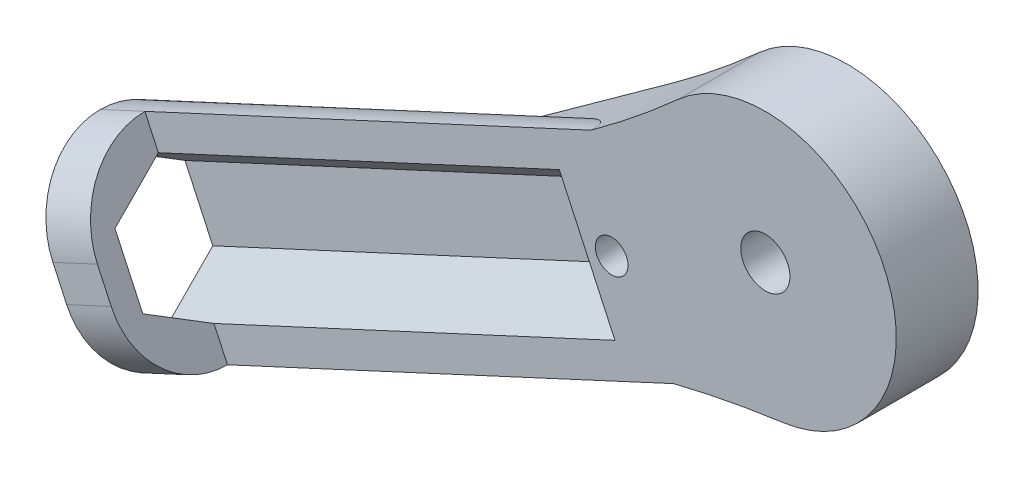
ISO-10303-21;
HEADER;
FILE_DESCRIPTION(('STEP AP214'),'2;1');
FILE_NAME('part.step','',(''),(''),'','','');
FILE_SCHEMA(('AUTOMOTIVE_DESIGN { 1 0 10303 214 1 1 1 1 }'));
ENDSEC;
DATA;
#1=APPLICATION_CONTEXT('core data for automotive mechanical design processes');
#2=APPLICATION_PROTOCOL_DEFINITION('international standard','automotive_design',2000,#1);
#3=PRODUCT_CONTEXT('',#1,'mechanical');
#4=PRODUCT('Part','Part','',(#3));
#5=PRODUCT_RELATED_PRODUCT_CATEGORY('part','',(#4));
#6=PRODUCT_DEFINITION_FORMATION('','',#4);
#7=PRODUCT_DEFINITION_CONTEXT('part definition',#1,'design');
#8=PRODUCT_DEFINITION('design','',#6,#7);
#9=PRODUCT_DEFINITION_SHAPE('','',#8);
#10=(LENGTH_UNIT() NAMED_UNIT(*) SI_UNIT(.MILLI.,.METRE.));
#11=(NAMED_UNIT(*) PLANE_ANGLE_UNIT() SI_UNIT($,.RADIAN.));
#12=(NAMED_UNIT(*) SI_UNIT($,.STERADIAN.) SOLID_ANGLE_UNIT());
#13=UNCERTAINTY_MEASURE_WITH_UNIT(LENGTH_MEASURE(1.E-05),#10,'distance_accuracy_value','');
#14=(GEOMETRIC_REPRESENTATION_CONTEXT(3) GLOBAL_UNCERTAINTY_ASSIGNED_CONTEXT((#13)) GLOBAL_UNIT_ASSIGNED_CONTEXT((#10,
#11,#12)) REPRESENTATION_CONTEXT('',''));
#15=CARTESIAN_POINT('',(0.,0.,0.));
#16=DIRECTION('',(0.,0.,1.));
#17=DIRECTION('',(1.,0.,0.));
#18=AXIS2_PLACEMENT_3D('',#15,#16,#17);
#19=CARTESIAN_POINT('',(6.53337750667996,9.63205993138693,10.));
#20=DIRECTION('',(0.,0.,1.));
#21=DIRECTION('',(1.,0.,0.));
#22=AXIS2_PLACEMENT_3D('',#19,#20,#21);
#23=PLANE('',#22);
#24=DIRECTION('',(-0.907296365048531,-0.420491743045832,0.));
#25=VECTOR('',#24,1.);
#26=CARTESIAN_POINT('',(9.47681970800078,3.28098537604723,10.));
#27=LINE('',#26,#25);
#28=CARTESIAN_POINT('',(-17.7420712434552,-9.33376691532774,10.));
#29=VERTEX_POINT('',#28);
#30=CARTESIAN_POINT('',(-15.0201821483096,-8.07229168619023,10.));
#31=VERTEX_POINT('',#30);
#32=EDGE_CURVE('E262',#29,#31,#27,.F.);
#33=ORIENTED_EDGE('',*,*,#32,.T.);
#34=DIRECTION('',(0.420491743045832,-0.907296365048531,0.));
#35=VECTOR('',#34,1.);
#36=CARTESIAN_POINT('',(-15.8611656378721,-6.2576989486042,10.));
#37=LINE('',#36,#35);
#38=CARTESIAN_POINT('',(-15.8611656378721,-6.2576989486042,10.));
#39=VERTEX_POINT('',#38);
#40=EDGE_CURVE('E197',#39,#31,#37,.T.);
#41=ORIENTED_EDGE('',*,*,#40,.F.);
#42=DIRECTION('',(-0.907296365048532,-0.420491743045832,0.));
#43=VECTOR('',#42,1.);
#44=CARTESIAN_POINT('',(-18.5830547330177,-7.51917417774169,10.));
#45=LINE('',#44,#43);
#46=CARTESIAN_POINT('',(-18.5830547330176,-7.51917417774169,10.));
#47=VERTEX_POINT('',#46);
#48=EDGE_CURVE('E296',#39,#47,#45,.T.);
#49=ORIENTED_EDGE('',*,*,#48,.T.);
#50=DIRECTION('',(-0.420491743045832,0.907296365048532,0.));
#51=VECTOR('',#50,1.);
#52=CARTESIAN_POINT('',(-20.685513444776,-2.98269235998802,10.));
#53=LINE('',#52,#51);
#54=EDGE_CURVE('E207',#29,#47,#53,.T.);
#55=ORIENTED_EDGE('',*,*,#54,.F.);
#56=EDGE_LOOP('',(#33,#41,#49,#55));
#57=FACE_BOUND('',#56,.T.);
#58=ADVANCED_FACE('F35',(#57),#23,.T.);
#59=CARTESIAN_POINT('',(-25.0004421505591,-12.6977008535377,5.));
#60=DIRECTION('',(0.907296365048531,0.420491743045832,0.));
#61=DIRECTION('',(-0.420491743045832,0.907296365048531,0.));
#62=AXIS2_PLACEMENT_3D('',#59,#60,#61);
#63=CYLINDRICAL_SURFACE('',#62,5.);
#64=DIRECTION('',(-0.907296365048531,-0.420491743045832,0.));
#65=VECTOR('',#64,1.);
#66=CARTESIAN_POINT('',(-15.639612528226,-13.8702487405704,5.));
#67=LINE('',#66,#65);
#68=CARTESIAN_POINT('',(-12.9177234330804,-12.6087735114329,5.00000000000001));
#69=VERTEX_POINT('',#68);
#70=CARTESIAN_POINT('',(-15.639612528226,-13.8702487405704,5.));
#71=VERTEX_POINT('',#70);
#72=EDGE_CURVE('E206',#69,#71,#67,.T.);
#73=ORIENTED_EDGE('',*,*,#72,.F.);
#74=CARTESIAN_POINT('',(-15.0201821483096,-8.07229168619023,5.00000000000001));
#75=DIRECTION('',(0.907296365048532,0.420491743045832,0.));
#76=DIRECTION('',(-0.420491743045832,0.907296365048532,0.));
#77=AXIS2_PLACEMENT_3D('',#74,#75,#76);
#78=CIRCLE('',#77,5.);
#79=EDGE_CURVE('E199',#31,#69,#78,.T.);
#80=ORIENTED_EDGE('',*,*,#79,.F.);
#81=ORIENTED_EDGE('',*,*,#32,.F.);
#82=CARTESIAN_POINT('',(-17.7420712434552,-9.33376691532774,5.));
#83=DIRECTION('',(0.907296365048532,0.420491743045832,0.));
#84=DIRECTION('',(-0.420491743045832,0.907296365048532,0.));
#85=AXIS2_PLACEMENT_3D('',#82,#83,#84);
#86=CIRCLE('',#85,5.);
#87=EDGE_CURVE('E286',#71,#29,#86,.F.);
#88=ORIENTED_EDGE('',*,*,#87,.F.);
#89=EDGE_LOOP('',(#73,#80,#81,#88));
#90=FACE_BOUND('',#89,.T.);
#91=ADVANCED_FACE('F270',(#90),#63,.T.);
#92=CARTESIAN_POINT('',(8.6358362184383,5.09557811363326,5.));
#93=DIRECTION('',(0.907296365048532,0.420491743045832,0.));
#94=DIRECTION('',(-0.420491743045832,0.907296365048532,0.));
#95=AXIS2_PLACEMENT_3D('',#92,#93,#94);
#96=CYLINDRICAL_SURFACE('',#95,5.);
#97=ORIENTED_EDGE('',*,*,#48,.F.);
#98=CARTESIAN_POINT('',(-15.8611656378721,-6.2576989486042,5.00000000000001));
#99=DIRECTION('',(0.907296365048532,0.420491743045832,0.));
#100=DIRECTION('',(-0.420491743045832,0.907296365048532,0.));
#101=AXIS2_PLACEMENT_3D('',#98,#99,#100);
#102=CIRCLE('',#101,4.99999999587291);
#103=CARTESIAN_POINT('',(-17.9636243531012,-1.72121712336154,5.));
#104=VERTEX_POINT('',#103);
#105=EDGE_CURVE('E187',#104,#39,#102,.T.);
#106=ORIENTED_EDGE('',*,*,#105,.F.);
#107=DIRECTION('',(-0.907296365048532,-0.420491743045832,0.));
#108=VECTOR('',#107,1.);
#109=CARTESIAN_POINT('',(9.29973298295998,10.9141433709005,5.));
#110=LINE('',#109,#108);
#111=CARTESIAN_POINT('',(-20.6855134482468,-2.98269235249903,5.));
#112=VERTEX_POINT('',#111);
#113=EDGE_CURVE('E352',#104,#112,#110,.T.);
#114=ORIENTED_EDGE('',*,*,#113,.T.);
#115=CARTESIAN_POINT('',(-18.5830547330176,-7.51917417774169,5.));
#116=DIRECTION('',(0.907296365048532,0.420491743045832,0.));
#117=DIRECTION('',(-0.420491743045832,0.907296365048532,0.));
#118=AXIS2_PLACEMENT_3D('',#115,#116,#117);
#119=CIRCLE('',#118,5.);
#120=EDGE_CURVE('E298',#47,#112,#119,.F.);
#121=ORIENTED_EDGE('',*,*,#120,.F.);
#122=EDGE_LOOP('',(#97,#106,#114,#121));
#123=FACE_BOUND('',#122,.T.);
#124=ADVANCED_FACE('F37',(#123),#96,.T.);
#125=CARTESIAN_POINT('',(17.6291965317977,0.747614784443277,5.));
#126=DIRECTION('',(0.,0.,1.));
#127=DIRECTION('',(1.,0.,0.));
#128=AXIS2_PLACEMENT_3D('',#125,#126,#127);
#129=PLANE('',#128);
#130=DIRECTION('',(-0.907296365048532,-0.420491743045832,0.));
#131=VECTOR('',#130,1.);
#132=CARTESIAN_POINT('',(7.35693081767827,7.85507634526451,5.));
#133=LINE('',#132,#131);
#134=CARTESIAN_POINT('',(7.35693081767827,7.85507634526451,5.));
#135=VERTEX_POINT('',#134);
#136=CARTESIAN_POINT('',(-17.1400710386321,-3.49820071697295,5.));
#137=VERTEX_POINT('',#136);
#138=EDGE_CURVE('E188',#135,#137,#133,.T.);
#139=ORIENTED_EDGE('',*,*,#138,.F.);
#140=DIRECTION('',(0.420491743045832,-0.907296365048532,0.));
#141=VECTOR('',#140,1.);
#142=CARTESIAN_POINT('',(11.8847762161495,-1.91467000403992,5.));
#143=LINE('',#142,#141);
#144=CARTESIAN_POINT('',(10.7557251122316,0.521487136926973,5.));
#145=VERTEX_POINT('',#144);
#146=EDGE_CURVE('E11',#135,#145,#143,.T.);
#147=ORIENTED_EDGE('',*,*,#146,.T.);
#148=DIRECTION('',(-0.907296365048532,-0.420491743045832,0.));
#149=VECTOR('',#148,1.);
#150=CARTESIAN_POINT('',(10.7557251122316,0.521487136926973,5.));
#151=LINE('',#150,#149);
#152=CARTESIAN_POINT('',(-13.7412767440787,-10.8317899253105,5.));
#153=VERTEX_POINT('',#152);
#154=EDGE_CURVE('E163',#145,#153,#151,.T.);
#155=ORIENTED_EDGE('',*,*,#154,.T.);
#156=DIRECTION('',(-0.420491743045832,0.907296365048532,0.));
#157=VECTOR('',#156,1.);
#158=CARTESIAN_POINT('',(-12.9177234330804,-12.6087735114329,5.00000000000001));
#159=LINE('',#158,#157);
#160=EDGE_CURVE('E203',#69,#153,#159,.T.);
#161=ORIENTED_EDGE('',*,*,#160,.F.);
#162=DIRECTION('',(0.907296365048531,0.420491743045832,0.));
#163=VECTOR('',#162,1.);
#164=CARTESIAN_POINT('',(-22.89798343533,-17.2341826787804,5.));
#165=LINE('',#164,#163);
#166=CARTESIAN_POINT('',(14.3456339009406,0.0265869818835722,5.));
#167=VERTEX_POINT('',#166);
#168=EDGE_CURVE('E225',#69,#167,#165,.T.);
#169=ORIENTED_EDGE('',*,*,#168,.T.);
#170=CARTESIAN_POINT('',(-11.4535958834117,-6.377955749876,5.));
#171=CARTESIAN_POINT('',(-2.85385262196095,-4.24310817262282,5.));
#172=CARTESIAN_POINT('',(5.74589063948981,-2.10826059536963,5.));
#173=CARTESIAN_POINT('',(14.3456339009406,0.0265869818835563,5.));
#174=CARTESIAN_POINT('',(16.4922817264739,0.559482647513285,5.));
#175=CARTESIAN_POINT('',(18.7231488164032,0.988675041765944,5.));
#176=CARTESIAN_POINT('',(21.0416467248101,1.30985822582497,5.));
#177=B_SPLINE_CURVE_WITH_KNOTS('',3,(#170,#171,#172,#173,#174,#175,#176),.UNSPECIFIED.,.F.,.F.,
(4,3,4),(-0.566348335152544,0.,0.14137054853711),.UNSPECIFIED.);
#178=CARTESIAN_POINT('',(21.0416467248101,1.30985822582497,5.));
#179=VERTEX_POINT('',#178);
#180=EDGE_CURVE('E228',#167,#179,#177,.T.);
#181=ORIENTED_EDGE('',*,*,#180,.T.);
#182=CARTESIAN_POINT('',(19.9438843439463,9.23418266107875,5.));
#183=DIRECTION('',(0.,0.,1.));
#184=DIRECTION('',(1.,0.,0.));
#185=AXIS2_PLACEMENT_3D('',#182,#183,#184);
#186=CIRCLE('',#185,8.);
#187=CARTESIAN_POINT('',(14.6070207198914,15.1938711309771,5.));
#188=VERTEX_POINT('',#187);
#189=EDGE_CURVE('E234',#179,#188,#186,.T.);
#190=ORIENTED_EDGE('',*,*,#189,.T.);
#191=CARTESIAN_POINT('',(14.6070207198914,15.1938711309771,5.));
#192=CARTESIAN_POINT('',(12.8633357738326,13.6324121984728,5.));
#193=CARTESIAN_POINT('',(11.0938797331584,12.2076317226324,5.));
#194=CARTESIAN_POINT('',(9.29973298295998,10.9141433709005,5.));
#195=CARTESIAN_POINT('',(2.11215370630823,5.73226509340125,5.));
#196=CARTESIAN_POINT('',(-5.07542557034351,0.550386815902035,5.));
#197=CARTESIAN_POINT('',(-12.2630048469952,-4.63149146159718,5.));
#198=B_SPLINE_CURVE_WITH_KNOTS('',3,(#191,#192,#193,#194,#195,#196,#197),.UNSPECIFIED.,.F.,.F.,
(4,3,4),(0.,0.14137054853711,0.707718883689652),.UNSPECIFIED.);
#199=CARTESIAN_POINT('',(9.29973298295998,10.9141433709005,5.));
#200=VERTEX_POINT('',#199);
#201=EDGE_CURVE('E320',#188,#200,#198,.T.);
#202=ORIENTED_EDGE('',*,*,#201,.T.);
#203=DIRECTION('',(-0.907296365048532,-0.420491743045832,0.));
#204=VECTOR('',#203,1.);
#205=CARTESIAN_POINT('',(9.29973298295998,10.9141433709005,5.));
#206=LINE('',#205,#204);
#207=EDGE_CURVE('E326',#200,#104,#206,.T.);
#208=ORIENTED_EDGE('',*,*,#207,.T.);
#209=EDGE_CURVE('E202',#137,#104,#159,.T.);
#210=ORIENTED_EDGE('',*,*,#209,.F.);
#211=EDGE_LOOP('',(#139,#147,#155,#161,#169,#181,#190,#202,#208,#210));
#212=FACE_BOUND('',#211,.T.);
#213=CARTESIAN_POINT('',(19.9438843553508,9.23418267129139,5.));
#214=DIRECTION('',(0.,0.,1.));
#215=DIRECTION('',(1.,0.,0.));
#216=AXIS2_PLACEMENT_3D('',#213,#214,#215);
#217=CIRCLE('',#216,1.50000000000001);
#218=CARTESIAN_POINT('',(21.4438843553508,9.23418267129139,5.));
#219=VERTEX_POINT('',#218);
#220=EDGE_CURVE('E219',#219,#219,#217,.T.);
#221=ORIENTED_EDGE('',*,*,#220,.F.);
#222=EDGE_LOOP('',(#221));
#223=FACE_BOUND('',#222,.T.);
#224=CARTESIAN_POINT('',(10.5533669770985,4.88209313076704,5.));
#225=DIRECTION('',(0.,0.,1.));
#226=DIRECTION('',(1.,0.,0.));
#227=AXIS2_PLACEMENT_3D('',#224,#225,#226);
#228=CIRCLE('',#227,0.999999999999997);
#229=CARTESIAN_POINT('',(11.5533669770985,4.88209313076704,5.));
#230=VERTEX_POINT('',#229);
#231=EDGE_CURVE('E213',#230,#230,#228,.T.);
#232=ORIENTED_EDGE('',*,*,#231,.F.);
#233=EDGE_LOOP('',(#232));
#234=FACE_BOUND('',#233,.T.);
#235=ADVANCED_FACE('F277',(#212,#223,#234),#129,.T.);
#236=CARTESIAN_POINT('',(17.6291965317977,0.747614784443277,0.));
#237=DIRECTION('',(0.,0.,1.));
#238=DIRECTION('',(1.,0.,0.));
#239=AXIS2_PLACEMENT_3D('',#236,#237,#238);
#240=PLANE('',#239);
#241=CARTESIAN_POINT('',(-11.414140005459,-6.36816100567319,0.));
#242=CARTESIAN_POINT('',(-2.8275487033258,-4.23657834315427,0.));
#243=CARTESIAN_POINT('',(5.75904259880739,-2.10499568063536,0.));
#244=CARTESIAN_POINT('',(14.3456339009406,0.0265869818835563,0.));
#245=CARTESIAN_POINT('',(16.4922817264739,0.559482647513285,0.));
#246=CARTESIAN_POINT('',(18.7231488164032,0.988675041765944,0.));
#247=CARTESIAN_POINT('',(21.0416467248101,1.30985822582497,0.));
#248=B_SPLINE_CURVE_WITH_KNOTS('',3,(#241,#242,#243,#244,#245,#246,#247),.UNSPECIFIED.,.F.,.F.,
(4,3,4),(-0.565482194148441,0.,0.14137054853711),.UNSPECIFIED.);
#249=CARTESIAN_POINT('',(-11.2613145319547,-6.33022276938704,0.));
#250=VERTEX_POINT('',#249);
#251=CARTESIAN_POINT('',(21.0416467248101,1.30985822582497,0.));
#252=VERTEX_POINT('',#251);
#253=EDGE_CURVE('E222',#250,#252,#248,.T.);
#254=ORIENTED_EDGE('',*,*,#253,.F.);
#255=DIRECTION('',(0.907296365048531,0.420491743045832,0.));
#256=VECTOR('',#255,1.);
#257=CARTESIAN_POINT('',(15.221240023649,5.94327016453043,0.));
#258=LINE('',#257,#256);
#259=CARTESIAN_POINT('',(-17.7420712434552,-9.33376691532775,0.));
#260=VERTEX_POINT('',#259);
#261=EDGE_CURVE('E303',#250,#260,#258,.F.);
#262=ORIENTED_EDGE('',*,*,#261,.T.);
#263=DIRECTION('',(-0.420491743045832,0.907296365048532,0.));
#264=VECTOR('',#263,1.);
#265=CARTESIAN_POINT('',(-26.3649475868884,9.27184066685778,0.));
#266=LINE('',#265,#264);
#267=CARTESIAN_POINT('',(-18.5830547330176,-7.51917417774169,0.));
#268=VERTEX_POINT('',#267);
#269=EDGE_CURVE('E210',#260,#268,#266,.T.);
#270=ORIENTED_EDGE('',*,*,#269,.T.);
#271=DIRECTION('',(-0.907296365048532,-0.420491743045832,0.));
#272=VECTOR('',#271,1.);
#273=CARTESIAN_POINT('',(14.3802565340865,7.75786290211646,0.));
#274=LINE('',#273,#272);
#275=CARTESIAN_POINT('',(-12.1022980194771,-4.51563003085547,0.));
#276=VERTEX_POINT('',#275);
#277=EDGE_CURVE('E311',#268,#276,#274,.F.);
#278=ORIENTED_EDGE('',*,*,#277,.T.);
#279=CARTESIAN_POINT('',(14.6070207198914,15.1938711309771,0.));
#280=CARTESIAN_POINT('',(12.8633357738326,13.6324121984728,0.));
#281=CARTESIAN_POINT('',(11.0938797331584,12.2076317226324,0.));
#282=CARTESIAN_POINT('',(9.29973298295998,10.9141433709005,0.));
#283=CARTESIAN_POINT('',(2.12314598216626,5.74018996397263,0.));
#284=CARTESIAN_POINT('',(-5.05344101862745,0.566236557044797,0.));
#285=CARTESIAN_POINT('',(-12.2300280194212,-4.60771684988304,0.));
#286=B_SPLINE_CURVE_WITH_KNOTS('',3,(#279,#280,#281,#282,#283,#284,#285),.UNSPECIFIED.,.F.,.F.,
(4,3,4),(0.,0.14137054853711,0.706852742685551),.UNSPECIFIED.);
#287=CARTESIAN_POINT('',(14.6070207198914,15.1938711309771,0.));
#288=VERTEX_POINT('',#287);
#289=EDGE_CURVE('E229',#288,#276,#286,.T.);
#290=ORIENTED_EDGE('',*,*,#289,.F.);
#291=CARTESIAN_POINT('',(19.9438843439463,9.23418266107875,0.));
#292=DIRECTION('',(0.,0.,1.));
#293=DIRECTION('',(1.,0.,0.));
#294=AXIS2_PLACEMENT_3D('',#291,#292,#293);
#295=CIRCLE('',#294,8.);
#296=EDGE_CURVE('E336',#252,#288,#295,.T.);
#297=ORIENTED_EDGE('',*,*,#296,.F.);
#298=EDGE_LOOP('',(#254,#262,#270,#278,#290,#297));
#299=FACE_BOUND('',#298,.T.);
#300=CARTESIAN_POINT('',(19.9438843553508,9.23418267129139,0.));
#301=DIRECTION('',(0.,0.,1.));
#302=DIRECTION('',(1.,0.,0.));
#303=AXIS2_PLACEMENT_3D('',#300,#301,#302);
#304=CIRCLE('',#303,1.50000000000001);
#305=CARTESIAN_POINT('',(21.4438843553508,9.23418267129139,0.));
#306=VERTEX_POINT('',#305);
#307=EDGE_CURVE('E216',#306,#306,#304,.T.);
#308=ORIENTED_EDGE('',*,*,#307,.T.);
#309=EDGE_LOOP('',(#308));
#310=FACE_BOUND('',#309,.T.);
#311=CARTESIAN_POINT('',(10.5533669770985,4.88209313076704,0.));
#312=DIRECTION('',(0.,0.,1.));
#313=DIRECTION('',(1.,0.,0.));
#314=AXIS2_PLACEMENT_3D('',#311,#312,#313);
#315=CIRCLE('',#314,0.999999999999997);
#316=CARTESIAN_POINT('',(11.5533669770985,4.88209313076704,0.));
#317=VERTEX_POINT('',#316);
#318=EDGE_CURVE('E212',#317,#317,#315,.T.);
#319=ORIENTED_EDGE('',*,*,#318,.T.);
#320=EDGE_LOOP('',(#319));
#321=FACE_BOUND('',#320,.T.);
#322=ADVANCED_FACE('F246',(#299,#310,#321),#240,.F.);
#323=DIRECTION('',(0.,0.,-1.));
#324=VECTOR('',#323,1.);
#325=SURFACE_OF_LINEAR_EXTRUSION('',#177,#324);
#326=ORIENTED_EDGE('',*,*,#253,.T.);
#327=DIRECTION('',(0.,0.,-1.));
#328=VECTOR('',#327,1.);
#329=CARTESIAN_POINT('',(21.0416467248101,1.30985822582497,5.));
#330=LINE('',#329,#328);
#331=EDGE_CURVE('E349',#179,#252,#330,.T.);
#332=ORIENTED_EDGE('',*,*,#331,.F.);
#333=ORIENTED_EDGE('',*,*,#180,.F.);
#334=CARTESIAN_POINT('',(14.3456339009406,0.026586981883569,5.));
#335=CARTESIAN_POINT('',(14.3456505521582,0.0265911154734314,4.96946069912121));
#336=CARTESIAN_POINT('',(14.3442015178452,0.0262313992239542,4.93893167509733));
#337=CARTESIAN_POINT('',(14.3385021671576,0.0248165610552538,4.8781975070483));
#338=CARTESIAN_POINT('',(14.3342560946385,0.0237624926540653,4.84799194269743));
#339=CARTESIAN_POINT('',(14.3231710051505,0.0210106690568126,4.78853753200314));
#340=CARTESIAN_POINT('',(14.3163695186102,0.0193222306208278,4.75928119630557));
#341=CARTESIAN_POINT('',(14.3003807931283,0.0153531014479313,4.70146631026291));
#342=CARTESIAN_POINT('',(14.2911925493639,0.0130721612682953,4.67290805936459));
#343=CARTESIAN_POINT('',(14.2545245466673,0.00396949455608997,4.57240849833956));
#344=CARTESIAN_POINT('',(14.2209803908918,-0.00435769121111787,4.50277172217219));
#345=CARTESIAN_POINT('',(14.143617740724,-0.0235626210862949,4.36955847063625));
#346=CARTESIAN_POINT('',(14.0997347446422,-0.0344563774485068,4.3060237181854));
#347=CARTESIAN_POINT('',(14.0094552160479,-0.0568678642842844,4.19056606211927));
#348=CARTESIAN_POINT('',(13.963685025754,-0.0682301081197769,4.13811311236543));
#349=CARTESIAN_POINT('',(13.8679657056496,-0.0919919987261222,4.03738834222646));
#350=CARTESIAN_POINT('',(13.8180128600748,-0.10439256791874,3.98912031877901));
#351=CARTESIAN_POINT('',(13.714988353016,-0.129967938322882,3.89614526678376));
#352=CARTESIAN_POINT('',(13.6619125947066,-0.143143756552903,3.85144310567428));
#353=CARTESIAN_POINT('',(13.5534710119736,-0.170063891623547,3.76516428889155));
#354=CARTESIAN_POINT('',(13.498106109386,-0.183807979622505,3.7235863937219));
#355=CARTESIAN_POINT('',(13.3802378847593,-0.213068236135912,3.6392714870863));
#356=CARTESIAN_POINT('',(13.3175563709779,-0.228628639948736,3.59680017747905));
#357=CARTESIAN_POINT('',(13.190520189311,-0.260164800553771,3.51459210917183));
#358=CARTESIAN_POINT('',(13.1261651770229,-0.276140642842352,3.47485591958923));
#359=CARTESIAN_POINT('',(12.9309110211167,-0.32461160866218,3.3590503396868));
#360=CARTESIAN_POINT('',(12.7980292819733,-0.357598902613507,3.28652719845308));
#361=CARTESIAN_POINT('',(12.5286913212869,-0.42446083969146,3.14870072206019));
#362=CARTESIAN_POINT('',(12.3922318199268,-0.458336297017919,3.08340431999451));
#363=CARTESIAN_POINT('',(12.1160397151806,-0.526899744524191,2.95827752316005));
#364=CARTESIAN_POINT('',(11.9762927020726,-0.561591311852647,2.89848108760998));
#365=CARTESIAN_POINT('',(11.6951343251122,-0.631387614094462,2.78380008969883));
#366=CARTESIAN_POINT('',(11.553725335038,-0.666491759728087,2.72890930412946));
#367=CARTESIAN_POINT('',(11.2695615804769,-0.737034133439095,2.62321258330872));
#368=CARTESIAN_POINT('',(11.1268074981696,-0.772472192168462,2.57240469010669));
#369=CARTESIAN_POINT('',(10.737051053526,-0.869227476165822,2.43892733284214));
#370=CARTESIAN_POINT('',(10.4889571560779,-0.930815670114887,2.35964147370335));
#371=CARTESIAN_POINT('',(9.99045216220296,-1.05456729223518,2.20916738366154));
#372=CARTESIAN_POINT('',(9.74004068859032,-1.11673081404108,2.13798049684941));
#373=CARTESIAN_POINT('',(9.23714479402287,-1.24157245750507,2.00218904867284));
#374=CARTESIAN_POINT('',(8.98465780675849,-1.30425121623797,1.93759462574079));
#375=CARTESIAN_POINT('',(8.47837999962315,-1.42993240428283,1.81407178397995));
#376=CARTESIAN_POINT('',(8.22458913454495,-1.49293484481729,1.75514356302188));
#377=CARTESIAN_POINT('',(7.71557566418026,-1.619295148952,1.64209142619059));
#378=CARTESIAN_POINT('',(7.46035140715119,-1.68265342258991,1.58797543461608));
#379=CARTESIAN_POINT('',(6.94907666986028,-1.80957507606635,1.48406337445165));
#380=CARTESIAN_POINT('',(6.69302617865387,-1.87313845862183,1.43426736333125));
#381=CARTESIAN_POINT('',(5.92373969814059,-2.06411036664369,1.2906100513216));
#382=CARTESIAN_POINT('',(5.40948720883792,-2.19177123366114,1.20250528414998));
#383=CARTESIAN_POINT('',(4.37878523459785,-2.44763836197879,1.03886171979346));
#384=CARTESIAN_POINT('',(3.86233452719384,-2.57584492675083,0.963331224961513));
#385=CARTESIAN_POINT('',(2.8287216036213,-2.83243468514487,0.82317157468343));
#386=CARTESIAN_POINT('',(2.31156114593114,-2.96081744223252,0.758528580878872));
#387=CARTESIAN_POINT('',(1.27653751228719,-3.21775740305547,0.638759818601978));
#388=CARTESIAN_POINT('',(0.758674975649145,-3.34631444808352,0.583628140404114));
#389=CARTESIAN_POINT('',(-0.27779107222253,-3.60361248174955,0.481885866189217));
#390=CARTESIAN_POINT('',(-0.796394517020884,-3.73235345389529,0.435274549247682));
#391=CARTESIAN_POINT('',(-1.64734483469957,-3.94359804211486,0.365240801403224));
#392=CARTESIAN_POINT('',(-1.97951536006127,-4.02605788071052,0.339512179689335));
#393=CARTESIAN_POINT('',(-2.64414124555164,-4.19104826685136,0.29110345971543));
#394=CARTESIAN_POINT('',(-2.97659665301769,-4.27357882614783,0.268424050162566));
#395=CARTESIAN_POINT('',(-3.64174327542092,-4.43869848288467,0.225993591473727));
#396=CARTESIAN_POINT('',(-3.97443452213013,-4.5212875882123,0.206243072667574));
#397=CARTESIAN_POINT('',(-4.64000622660452,-4.68651276966099,0.169571697924855));
#398=CARTESIAN_POINT('',(-4.97288670308562,-4.76914885042821,0.152651203086555));
#399=CARTESIAN_POINT('',(-5.63879089001685,-4.93445656915109,0.121558522325634));
#400=CARTESIAN_POINT('',(-5.97181460863169,-5.01712820913361,0.107386522357818));
#401=CARTESIAN_POINT('',(-6.6352566619743,-5.18182471426944,0.0818290823382518));
#402=CARTESIAN_POINT('',(-6.96567421151261,-5.263849384503,0.0704219651875502));
#403=CARTESIAN_POINT('',(-7.62656151329299,-5.42791168405649,0.0501957021481546));
#404=CARTESIAN_POINT('',(-7.95703126051442,-5.50994931213007,0.0413763818503327));
#405=CARTESIAN_POINT('',(-8.61797774018146,-5.6740263023277,0.0262868244726058));
#406=CARTESIAN_POINT('',(-8.94845446472647,-5.75606566249046,0.0200162194593761));
#407=CARTESIAN_POINT('',(-9.60936985691718,-5.92013493536195,0.00999544984633223));
#408=CARTESIAN_POINT('',(-9.93980851652353,-6.00216484607494,0.00624472139254689));
#409=CARTESIAN_POINT('',(-10.6006029972299,-6.16620410321438,0.00124834745950484));
#410=CARTESIAN_POINT('',(-10.9309588128909,-6.24821344829061,1.93900149774657E-06));
#411=CARTESIAN_POINT('',(-11.2613145319547,-6.33022276938704,0.));
#412=B_SPLINE_CURVE_WITH_KNOTS('',3,(#334,#335,#336,#337,#338,#339,#340,#341,#342,#343,#344,
#345,#346,#347,#348,#349,#350,#351,#352,#353,#354,#355,#356,#357,#358,#359,#360,#361,#362,#363,
#364,#365,#366,#367,#368,#369,#370,#371,#372,#373,#374,#375,#376,#377,#378,#379,#380,#381,#382,
#383,#384,#385,#386,#387,#388,#389,#390,#391,#392,#393,#394,#395,#396,#397,#398,#399,#400,#401,
#402,#403,#404,#405,#406,#407,#408,#409,#410,#411),.UNSPECIFIED.,.F.,.F.,(4,2,2,2,2,2,2,2,2,2,2,
2,2,2,2,2,2,2,2,2,2,2,2,2,2,2,2,2,2,2,2,2,2,2,2,2,2,2,4),(0.,0.0915648762242349,
0.182991143036287,0.273124061601327,0.363294987720892,0.595078481633077,0.828348212656244,
1.03964036130564,1.2511222495748,1.46288804132824,1.67456937030695,1.9063785484645,
2.13823581602733,2.60271798144136,3.0676419620603,3.5352669690945,4.00229007665562,
4.46908786997346,5.27181187081557,6.0746688965605,6.87874258367714,7.68284433984359,
8.488246595528,9.29365956398805,10.9048597522602,12.517119576468,14.1273144443659,
15.7365052080566,17.3455597518686,18.3752024512885,19.4050773206035,20.4351384407094,
21.4653308918563,22.4955930183945,23.5174956005779,24.5393292940086,25.5610154227755,
26.5824728602519,27.6036190481406),.UNSPECIFIED.);
#413=EDGE_CURVE('E253',#167,#250,#412,.T.);
#414=ORIENTED_EDGE('',*,*,#413,.T.);
#415=EDGE_LOOP('',(#326,#332,#333,#414));
#416=FACE_BOUND('',#415,.T.);
#417=ADVANCED_FACE('F240',(#416),#325,.F.);
#418=CARTESIAN_POINT('',(19.9438843439463,9.23418266107875,5.));
#419=DIRECTION('',(0.,0.,-1.));
#420=DIRECTION('',(-1.,0.,0.));
#421=AXIS2_PLACEMENT_3D('',#418,#419,#420);
#422=CYLINDRICAL_SURFACE('',#421,8.);
#423=ORIENTED_EDGE('',*,*,#296,.T.);
#424=DIRECTION('',(0.,0.,-1.));
#425=VECTOR('',#424,1.);
#426=CARTESIAN_POINT('',(14.6070207198914,15.1938711309771,5.));
#427=LINE('',#426,#425);
#428=EDGE_CURVE('E332',#188,#288,#427,.T.);
#429=ORIENTED_EDGE('',*,*,#428,.F.);
#430=ORIENTED_EDGE('',*,*,#189,.F.);
#431=ORIENTED_EDGE('',*,*,#331,.T.);
#432=EDGE_LOOP('',(#423,#429,#430,#431));
#433=FACE_BOUND('',#432,.T.);
#434=ADVANCED_FACE('F245',(#433),#422,.T.);
#435=DIRECTION('',(0.,0.,-1.));
#436=VECTOR('',#435,1.);
#437=SURFACE_OF_LINEAR_EXTRUSION('',#198,#436);
#438=ORIENTED_EDGE('',*,*,#289,.T.);
#439=CARTESIAN_POINT('',(-12.1022980194771,-4.51563003085547,0.));
#440=CARTESIAN_POINT('',(-11.6517344716657,-4.19079667999128,1.39951542045889E-05));
#441=CARTESIAN_POINT('',(-11.2011699737706,-3.86596264416515,0.00332462738864167));
#442=CARTESIAN_POINT('',(-10.3000623251384,-3.21630996272571,0.0166391500849802));
#443=CARTESIAN_POINT('',(-9.84951918075546,-2.89149132169338,0.026643692467291));
#444=CARTESIAN_POINT('',(-8.94854824560854,-2.24193720370794,0.0534465625088568));
#445=CARTESIAN_POINT('',(-8.49812045985288,-1.91720173036556,0.0702451471489911));
#446=CARTESIAN_POINT('',(-7.59653658511011,-1.26720571417561,0.110883136240517));
#447=CARTESIAN_POINT('',(-7.14538092561277,-0.941945480968254,0.134737086283532));
#448=CARTESIAN_POINT('',(-6.24337561515254,-0.291645631108347,0.189770526284152));
#449=CARTESIAN_POINT('',(-5.79252595577287,0.0333939916122725,0.220949805823671));
#450=CARTESIAN_POINT('',(-4.89123248316635,0.683180642665007,0.291050184534374));
#451=CARTESIAN_POINT('',(-4.4407886592615,1.00792767869541,0.329971073662623));
#452=CARTESIAN_POINT('',(-3.61494216012044,1.60332090772723,0.408993435848913));
#453=CARTESIAN_POINT('',(-3.23946001382536,1.87402439531111,0.447833076302049));
#454=CARTESIAN_POINT('',(-2.48894666512343,2.41510626292195,0.53173462473392));
#455=CARTESIAN_POINT('',(-2.11391546818671,2.68548463900523,0.576796607438162));
#456=CARTESIAN_POINT('',(-1.36440292908111,3.22584497391257,0.673701131869525));
#457=CARTESIAN_POINT('',(-0.989921624156847,3.49582690588516,0.725544113232019));
#458=CARTESIAN_POINT('',(-0.241922265875535,4.03509631455134,0.836696571204302));
#459=CARTESIAN_POINT('',(0.131596243149211,4.30438411975812,0.896001362262184));
#460=CARTESIAN_POINT('',(0.8776736342667,4.84226788806988,1.02305542781039));
#461=CARTESIAN_POINT('',(1.2502325616379,5.11086388381834,1.09080429612491));
#462=CARTESIAN_POINT('',(1.99406749069605,5.64713095129299,1.23602994794887));
#463=CARTESIAN_POINT('',(2.36534363880085,5.91480212857899,1.31350558082598));
#464=CARTESIAN_POINT('',(3.02240344351803,6.38850875469469,1.46118796904025));
#465=CARTESIAN_POINT('',(3.30852909760319,6.59479076626922,1.5290749520449));
#466=CARTESIAN_POINT('',(3.87946409087845,7.00640579347702,1.67297424890549));
#467=CARTESIAN_POINT('',(4.16427332235959,7.21173873145762,1.74898721576409));
#468=CARTESIAN_POINT('',(4.73224899238293,7.62122023744987,1.91081977960782));
#469=CARTESIAN_POINT('',(5.01541440573161,7.82536806634924,1.99664492322809));
#470=CARTESIAN_POINT('',(5.43816818987915,8.13015199519173,2.13455167568967));
#471=CARTESIAN_POINT('',(5.5787436189441,8.2314997138302,2.18204499411485));
#472=CARTESIAN_POINT('',(5.85908388922545,8.43361075858738,2.28052872314862));
#473=CARTESIAN_POINT('',(5.99884876200121,8.53437410745879,2.33151899659677));
#474=CARTESIAN_POINT('',(6.28388308396448,8.7398693242032,2.44001368094901));
#475=CARTESIAN_POINT('',(6.42910440762628,8.84456649602533,2.49771118525918));
#476=CARTESIAN_POINT('',(6.71813644252239,9.05294386001417,2.6183563549298));
#477=CARTESIAN_POINT('',(6.86194695554206,9.15662390927824,2.68130474654411));
#478=CARTESIAN_POINT('',(7.1473622008597,9.3623937523439,2.81343952314962));
#479=CARTESIAN_POINT('',(7.28897071060975,9.46448626949588,2.88261341383825));
#480=CARTESIAN_POINT('',(7.56944842992358,9.66669640799914,3.02886561085949));
#481=CARTESIAN_POINT('',(7.70831861766341,9.76681473456547,3.10594103132245));
#482=CARTESIAN_POINT('',(7.95298680905604,9.9432080287989,3.25296091164086));
#483=CARTESIAN_POINT('',(8.05954888972943,10.0200338570496,3.3209472750703));
#484=CARTESIAN_POINT('',(8.21672568383041,10.1333503136381,3.42914691771113));
#485=CARTESIAN_POINT('',(8.26872946454323,10.1708423886819,3.46629458408516));
#486=CARTESIAN_POINT('',(8.37157432363331,10.2449882896534,3.54295282828263));
#487=CARTESIAN_POINT('',(8.42241556859793,10.2816422356821,3.58246306458726));
#488=CARTESIAN_POINT('',(8.52304371620945,10.3541900006726,3.6645468407911));
#489=CARTESIAN_POINT('',(8.57281879330539,10.390075294015,3.70714253618221));
#490=CARTESIAN_POINT('',(8.67046610069225,10.4604740251494,3.79559713908559));
#491=CARTESIAN_POINT('',(8.71833763026451,10.4949869577589,3.84145723124263));
#492=CARTESIAN_POINT('',(8.81139698067926,10.5620780057838,3.93687368369538));
#493=CARTESIAN_POINT('',(8.85659173129446,10.594661117212,3.98641967647787));
#494=CARTESIAN_POINT('',(8.94346306469132,10.657290920396,4.0899555674073));
#495=CARTESIAN_POINT('',(8.98514313266984,10.6873401248012,4.14394095590077));
#496=CARTESIAN_POINT('',(9.06184263895933,10.7426365591414,4.254564364468));
#497=CARTESIAN_POINT('',(9.09707841644955,10.768039758597,4.31097106068688));
#498=CARTESIAN_POINT('',(9.16126534275258,10.8143152605855,4.42905805163923));
#499=CARTESIAN_POINT('',(9.19022182812511,10.8351914105059,4.49073380573533));
#500=CARTESIAN_POINT('',(9.23517054933619,10.8675971472749,4.60825601901679));
#501=CARTESIAN_POINT('',(9.25253324964324,10.8801147691468,4.66329435708647));
#502=CARTESIAN_POINT('',(9.27962231269677,10.8996446027656,4.77611879520681));
#503=CARTESIAN_POINT('',(9.28937040680498,10.9066724817165,4.83389657287082));
#504=CARTESIAN_POINT('',(9.29641273432809,10.9117496408838,4.91010419680233));
#505=CARTESIAN_POINT('',(9.29765579544892,10.9126458245879,4.92804730839362));
#506=CARTESIAN_POINT('',(9.29931554285394,10.9138424178627,4.9639911588143));
#507=CARTESIAN_POINT('',(9.29973224395578,10.9141428381161,4.98199189660459));
#508=CARTESIAN_POINT('',(9.29973298295998,10.9141433709005,4.99999999999998));
#509=B_SPLINE_CURVE_WITH_KNOTS('',3,(#439,#440,#441,#442,#443,#444,#445,#446,#447,#448,#449,
#450,#451,#452,#453,#454,#455,#456,#457,#458,#459,#460,#461,#462,#463,#464,#465,#466,#467,#468,
#469,#470,#471,#472,#473,#474,#475,#476,#477,#478,#479,#480,#481,#482,#483,#484,#485,#486,#487,
#488,#489,#490,#491,#492,#493,#494,#495,#496,#497,#498,#499,#500,#501,#502,#503,#504,#505,#506,
#507,#508),.UNSPECIFIED.,.F.,.F.,(4,2,2,2,2,2,2,2,2,2,2,2,2,2,2,2,2,2,2,2,2,2,2,2,2,2,2,2,2,2,2,
2,2,2,4),(0.,1.66634071758443,3.33284374384209,4.99940981054826,6.66943596672685,
8.33941415772512,10.0093470455753,11.4028593683917,12.7963884276666,14.1900078790282,
15.5827565511639,16.9754382553382,18.3679553665159,19.4454931216509,20.5231175327179,
21.6013541445186,22.1403943707264,22.6794134663357,23.2436316767424,23.807928054365,
24.3711161475503,24.9340992758741,25.3776026508007,25.5998453310912,25.8220559626247,
26.0460605423278,26.2701468315248,26.493625061553,26.7168790163705,26.9300084206594,
27.1429559773104,27.3194690040871,27.495476420072,27.5494798898357,27.6034823912421),.UNSPECIFIED.);
#510=EDGE_CURVE('E305',#276,#200,#509,.T.);
#511=ORIENTED_EDGE('',*,*,#510,.T.);
#512=ORIENTED_EDGE('',*,*,#201,.F.);
#513=ORIENTED_EDGE('',*,*,#428,.T.);
#514=EDGE_LOOP('',(#438,#511,#512,#513));
#515=FACE_BOUND('',#514,.T.);
#516=ADVANCED_FACE('F313',(#515),#437,.F.);
#517=CARTESIAN_POINT('',(19.9438843553508,9.23418267129139,5.));
#518=DIRECTION('',(0.,0.,-1.));
#519=DIRECTION('',(-1.,0.,0.));
#520=AXIS2_PLACEMENT_3D('',#517,#518,#519);
#521=CYLINDRICAL_SURFACE('',#520,1.50000000000001);
#522=ORIENTED_EDGE('',*,*,#220,.T.);
#523=EDGE_LOOP('',(#522));
#524=FACE_BOUND('',#523,.T.);
#525=ORIENTED_EDGE('',*,*,#307,.F.);
#526=EDGE_LOOP('',(#525));
#527=FACE_BOUND('',#526,.T.);
#528=ADVANCED_FACE('F317',(#524,#527),#521,.F.);
#529=CARTESIAN_POINT('',(10.5533669770985,4.88209313076704,5.));
#530=DIRECTION('',(0.,0.,-1.));
#531=DIRECTION('',(-1.,0.,0.));
#532=AXIS2_PLACEMENT_3D('',#529,#530,#531);
#533=CYLINDRICAL_SURFACE('',#532,0.999999999999997);
#534=ORIENTED_EDGE('',*,*,#231,.T.);
#535=EDGE_LOOP('',(#534));
#536=FACE_BOUND('',#535,.T.);
#537=ORIENTED_EDGE('',*,*,#318,.F.);
#538=EDGE_LOOP('',(#537));
#539=FACE_BOUND('',#538,.T.);
#540=ADVANCED_FACE('F417',(#536,#539),#533,.F.);
#541=CARTESIAN_POINT('',(-26.3649475868884,9.27184066685778,0.));
#542=DIRECTION('',(0.907296365048532,0.420491743045832,0.));
#543=DIRECTION('',(-0.420491743045832,0.907296365048532,0.));
#544=AXIS2_PLACEMENT_3D('',#541,#542,#543);
#545=PLANE('',#544);
#546=DIRECTION('',(0.210245871522916,-0.453648182524265,0.866025403784439));
#547=VECTOR('',#546,1.);
#548=CARTESIAN_POINT('',(-17.3128644128627,-10.2598678523636,1.5));
#549=LINE('',#548,#547);
#550=CARTESIAN_POINT('',(-17.3128644128627,-10.2598678523636,1.5));
#551=VERTEX_POINT('',#550);
#552=CARTESIAN_POINT('',(-16.4631658392243,-12.093265154448,5.));
#553=VERTEX_POINT('',#552);
#554=EDGE_CURVE('E176',#551,#553,#549,.T.);
#555=ORIENTED_EDGE('',*,*,#554,.F.);
#556=DIRECTION('',(0.420491743045832,-0.907296365048532,0.));
#557=VECTOR('',#556,1.);
#558=CARTESIAN_POINT('',(-19.0122615601393,-6.59307324819483,1.5));
#559=LINE('',#558,#557);
#560=CARTESIAN_POINT('',(-19.0122615601393,-6.59307324819483,1.5));
#561=VERTEX_POINT('',#560);
#562=EDGE_CURVE('E50',#561,#551,#559,.T.);
#563=ORIENTED_EDGE('',*,*,#562,.F.);
#564=DIRECTION('',(0.210245871522916,-0.453648182524266,-0.866025403784438));
#565=VECTOR('',#564,1.);
#566=CARTESIAN_POINT('',(-19.8619601337777,-4.75967594611044,5.));
#567=LINE('',#566,#565);
#568=CARTESIAN_POINT('',(-19.8619601337777,-4.75967594611044,5.));
#569=VERTEX_POINT('',#568);
#570=EDGE_CURVE('E168',#569,#561,#567,.T.);
#571=ORIENTED_EDGE('',*,*,#570,.F.);
#572=DIRECTION('',(-0.210245871522916,0.453648182524266,-0.866025403784439));
#573=VECTOR('',#572,1.);
#574=CARTESIAN_POINT('',(-19.0122615601393,-6.59307324819483,8.5));
#575=LINE('',#574,#573);
#576=CARTESIAN_POINT('',(-19.0122615601393,-6.59307324819483,8.5));
#577=VERTEX_POINT('',#576);
#578=EDGE_CURVE('E171',#577,#569,#575,.T.);
#579=ORIENTED_EDGE('',*,*,#578,.F.);
#580=DIRECTION('',(-0.420491743045832,0.907296365048532,0.));
#581=VECTOR('',#580,1.);
#582=CARTESIAN_POINT('',(-17.3128644128627,-10.2598678523636,8.5));
#583=LINE('',#582,#581);
#584=CARTESIAN_POINT('',(-17.3128644128627,-10.2598678523636,8.5));
#585=VERTEX_POINT('',#584);
#586=EDGE_CURVE('E180',#585,#577,#583,.T.);
#587=ORIENTED_EDGE('',*,*,#586,.F.);
#588=DIRECTION('',(-0.210245871522916,0.453648182524266,0.866025403784439));
#589=VECTOR('',#588,1.);
#590=CARTESIAN_POINT('',(-16.4631658392243,-12.093265154448,5.));
#591=LINE('',#590,#589);
#592=EDGE_CURVE('E178',#553,#585,#591,.T.);
#593=ORIENTED_EDGE('',*,*,#592,.F.);
#594=EDGE_LOOP('',(#555,#563,#571,#579,#587,#593));
#595=FACE_BOUND('',#594,.T.);
#596=ORIENTED_EDGE('',*,*,#269,.F.);
#597=CARTESIAN_POINT('',(-17.7420712434552,-9.33376691532774,5.));
#598=DIRECTION('',(0.907296365048532,0.420491743045832,0.));
#599=DIRECTION('',(-0.420491743045832,0.907296365048532,0.));
#600=AXIS2_PLACEMENT_3D('',#597,#598,#599);
#601=CIRCLE('',#600,5.);
#602=EDGE_CURVE('E290',#260,#71,#601,.F.);
#603=ORIENTED_EDGE('',*,*,#602,.T.);
#604=ORIENTED_EDGE('',*,*,#87,.T.);
#605=ORIENTED_EDGE('',*,*,#54,.T.);
#606=ORIENTED_EDGE('',*,*,#120,.T.);
#607=CARTESIAN_POINT('',(-18.5830547330176,-7.51917417774169,5.));
#608=DIRECTION('',(0.907296365048532,0.420491743045832,0.));
#609=DIRECTION('',(-0.420491743045832,0.907296365048532,0.));
#610=AXIS2_PLACEMENT_3D('',#607,#608,#609);
#611=CIRCLE('',#610,5.);
#612=EDGE_CURVE('E353',#112,#268,#611,.F.);
#613=ORIENTED_EDGE('',*,*,#612,.T.);
#614=EDGE_LOOP('',(#596,#603,#604,#605,#606,#613));
#615=FACE_BOUND('',#614,.T.);
#616=ADVANCED_FACE('F293',(#595,#615),#545,.F.);
#617=CARTESIAN_POINT('',(11.4021916981891,6.37766154565781,5.));
#618=DIRECTION('',(-0.907296365048532,-0.420491743045832,0.));
#619=DIRECTION('',(0.420491743045832,-0.907296365048532,0.));
#620=AXIS2_PLACEMENT_3D('',#617,#618,#619);
#621=CYLINDRICAL_SURFACE('',#620,5.);
#622=ORIENTED_EDGE('',*,*,#510,.F.);
#623=ORIENTED_EDGE('',*,*,#277,.F.);
#624=ORIENTED_EDGE('',*,*,#612,.F.);
#625=ORIENTED_EDGE('',*,*,#113,.F.);
#626=ORIENTED_EDGE('',*,*,#207,.F.);
#627=EDGE_LOOP('',(#622,#623,#624,#625,#626));
#628=FACE_BOUND('',#627,.T.);
#629=ADVANCED_FACE('F249',(#628),#621,.T.);
#630=CARTESIAN_POINT('',(-25.0004421505591,-12.6977008535377,5.));
#631=DIRECTION('',(0.907296365048531,0.420491743045832,0.));
#632=DIRECTION('',(-0.420491743045832,0.907296365048531,0.));
#633=AXIS2_PLACEMENT_3D('',#630,#631,#632);
#634=CYLINDRICAL_SURFACE('',#633,5.);
#635=ORIENTED_EDGE('',*,*,#602,.F.);
#636=ORIENTED_EDGE('',*,*,#261,.F.);
#637=ORIENTED_EDGE('',*,*,#413,.F.);
#638=ORIENTED_EDGE('',*,*,#168,.F.);
#639=ORIENTED_EDGE('',*,*,#72,.T.);
#640=EDGE_LOOP('',(#635,#636,#637,#638,#639));
#641=FACE_BOUND('',#640,.T.);
#642=ADVANCED_FACE('F265',(#641),#634,.T.);
#643=CARTESIAN_POINT('',(-15.8611656378721,-6.2576989486042,5.00000000000001));
#644=DIRECTION('',(0.907296365048532,0.420491743045832,0.));
#645=DIRECTION('',(-0.420491743045832,0.907296365048532,0.));
#646=AXIS2_PLACEMENT_3D('',#643,#644,#645);
#647=PLANE('',#646);
#648=DIRECTION('',(0.210245871522916,-0.453648182524265,0.866025403784439));
#649=VECTOR('',#648,1.);
#650=CARTESIAN_POINT('',(-16.8203446884421,-4.18807527488076,6.31698729453362));
#651=LINE('',#650,#649);
#652=CARTESIAN_POINT('',(-16.2903724649937,-5.33159801905733,8.5));
#653=VERTEX_POINT('',#652);
#654=EDGE_CURVE('E43',#137,#653,#651,.T.);
#655=ORIENTED_EDGE('',*,*,#654,.F.);
#656=ORIENTED_EDGE('',*,*,#209,.T.);
#657=ORIENTED_EDGE('',*,*,#105,.T.);
#658=ORIENTED_EDGE('',*,*,#40,.T.);
#659=ORIENTED_EDGE('',*,*,#79,.T.);
#660=ORIENTED_EDGE('',*,*,#160,.T.);
#661=DIRECTION('',(0.210245871522916,-0.453648182524266,-0.866025403784438));
#662=VECTOR('',#661,1.);
#663=CARTESIAN_POINT('',(-14.2712489675271,-9.68826718113391,7.18301270546639));
#664=LINE('',#663,#662);
#665=CARTESIAN_POINT('',(-14.5909753177171,-8.9983926232261,8.5));
#666=VERTEX_POINT('',#665);
#667=EDGE_CURVE('E261',#666,#153,#664,.T.);
#668=ORIENTED_EDGE('',*,*,#667,.F.);
#669=DIRECTION('',(0.420491743045832,-0.907296365048532,0.));
#670=VECTOR('',#669,1.);
#671=CARTESIAN_POINT('',(-15.8611656378721,-6.2576989486042,8.5));
#672=LINE('',#671,#670);
#673=EDGE_CURVE('E392',#653,#666,#672,.T.);
#674=ORIENTED_EDGE('',*,*,#673,.F.);
#675=EDGE_LOOP('',(#655,#656,#657,#658,#659,#660,#668,#674));
#676=FACE_BOUND('',#675,.T.);
#677=ADVANCED_FACE('F268',(#676),#647,.T.);
#678=CARTESIAN_POINT('',(8.20662939131661,6.02167904318013,1.5));
#679=DIRECTION('',(0.,0.,-1.));
#680=DIRECTION('',(0.,1.,0.));
#681=AXIS2_PLACEMENT_3D('',#678,#679,#680);
#682=PLANE('',#681);
#683=ORIENTED_EDGE('',*,*,#562,.T.);
#684=DIRECTION('',(-0.907296365048532,-0.420491743045832,0.));
#685=VECTOR('',#684,1.);
#686=CARTESIAN_POINT('',(9.90602653859329,2.35488443901136,1.5));
#687=LINE('',#686,#685);
#688=CARTESIAN_POINT('',(9.90602653859329,2.35488443901136,1.5));
#689=VERTEX_POINT('',#688);
#690=EDGE_CURVE('E146',#689,#551,#687,.T.);
#691=ORIENTED_EDGE('',*,*,#690,.F.);
#692=DIRECTION('',(0.420491743045832,-0.907296365048532,0.));
#693=VECTOR('',#692,1.);
#694=CARTESIAN_POINT('',(8.20662939131661,6.02167904318013,1.5));
#695=LINE('',#694,#693);
#696=CARTESIAN_POINT('',(8.20662939131661,6.02167904318013,1.5));
#697=VERTEX_POINT('',#696);
#698=EDGE_CURVE('E150',#697,#689,#695,.T.);
#699=ORIENTED_EDGE('',*,*,#698,.F.);
#700=DIRECTION('',(-0.907296365048532,-0.420491743045832,0.));
#701=VECTOR('',#700,1.);
#702=CARTESIAN_POINT('',(8.20662939131661,6.02167904318013,1.5));
#703=LINE('',#702,#701);
#704=EDGE_CURVE('E185',#697,#561,#703,.T.);
#705=ORIENTED_EDGE('',*,*,#704,.T.);
#706=EDGE_LOOP('',(#683,#691,#699,#705));
#707=FACE_BOUND('',#706,.T.);
#708=ADVANCED_FACE('F148',(#707),#682,.F.);
#709=CARTESIAN_POINT('',(7.35693081767827,7.85507634526451,5.));
#710=DIRECTION('',(-0.364156531559289,0.785741700893308,-0.5));
#711=DIRECTION('',(0.,0.536862159193648,0.843669972220141));
#712=AXIS2_PLACEMENT_3D('',#709,#710,#711);
#713=PLANE('',#712);
#714=ORIENTED_EDGE('',*,*,#570,.T.);
#715=ORIENTED_EDGE('',*,*,#704,.F.);
#716=DIRECTION('',(0.210245871522916,-0.453648182524266,-0.866025403784438));
#717=VECTOR('',#716,1.);
#718=CARTESIAN_POINT('',(7.35693081767827,7.85507634526451,5.));
#719=LINE('',#718,#717);
#720=EDGE_CURVE('E156',#135,#697,#719,.T.);
#721=ORIENTED_EDGE('',*,*,#720,.F.);
#722=ORIENTED_EDGE('',*,*,#138,.T.);
#723=EDGE_CURVE('E191',#137,#569,#133,.T.);
#724=ORIENTED_EDGE('',*,*,#723,.T.);
#725=EDGE_LOOP('',(#714,#715,#721,#722,#724));
#726=FACE_BOUND('',#725,.T.);
#727=ADVANCED_FACE('F385',(#726),#713,.F.);
#728=CARTESIAN_POINT('',(8.20662939131661,6.02167904318013,8.5));
#729=DIRECTION('',(-0.364156531559289,0.785741700893308,0.5));
#730=DIRECTION('',(0.,-0.536862159193648,0.843669972220142));
#731=AXIS2_PLACEMENT_3D('',#728,#729,#730);
#732=PLANE('',#731);
#733=ORIENTED_EDGE('',*,*,#654,.T.);
#734=DIRECTION('',(-0.907296365048532,-0.420491743045832,0.));
#735=VECTOR('',#734,1.);
#736=CARTESIAN_POINT('',(8.20662939131661,6.02167904318013,8.5));
#737=LINE('',#736,#735);
#738=EDGE_CURVE('E192',#653,#577,#737,.T.);
#739=ORIENTED_EDGE('',*,*,#738,.T.);
#740=ORIENTED_EDGE('',*,*,#578,.T.);
#741=ORIENTED_EDGE('',*,*,#723,.F.);
#742=EDGE_LOOP('',(#733,#739,#740,#741));
#743=FACE_BOUND('',#742,.T.);
#744=ADVANCED_FACE('F396',(#743),#732,.F.);
#745=CARTESIAN_POINT('',(9.90602653859329,2.35488443901136,8.5));
#746=DIRECTION('',(0.,0.,1.));
#747=DIRECTION('',(1.,0.,0.));
#748=AXIS2_PLACEMENT_3D('',#745,#746,#747);
#749=PLANE('',#748);
#750=ORIENTED_EDGE('',*,*,#673,.T.);
#751=DIRECTION('',(-0.907296365048532,-0.420491743045832,0.));
#752=VECTOR('',#751,1.);
#753=CARTESIAN_POINT('',(9.90602653859329,2.35488443901136,8.5));
#754=LINE('',#753,#752);
#755=EDGE_CURVE('E58',#666,#585,#754,.T.);
#756=ORIENTED_EDGE('',*,*,#755,.T.);
#757=ORIENTED_EDGE('',*,*,#586,.T.);
#758=ORIENTED_EDGE('',*,*,#738,.F.);
#759=EDGE_LOOP('',(#750,#756,#757,#758));
#760=FACE_BOUND('',#759,.T.);
#761=ADVANCED_FACE('F398',(#760),#749,.F.);
#762=CARTESIAN_POINT('',(10.7557251122316,0.521487136926973,5.));
#763=DIRECTION('',(0.364156531559289,-0.785741700893308,0.5));
#764=DIRECTION('',(0.,-0.536862159193648,-0.843669972220141));
#765=AXIS2_PLACEMENT_3D('',#762,#763,#764);
#766=PLANE('',#765);
#767=ORIENTED_EDGE('',*,*,#667,.T.);
#768=EDGE_CURVE('E155',#153,#553,#151,.T.);
#769=ORIENTED_EDGE('',*,*,#768,.T.);
#770=ORIENTED_EDGE('',*,*,#592,.T.);
#771=ORIENTED_EDGE('',*,*,#755,.F.);
#772=EDGE_LOOP('',(#767,#769,#770,#771));
#773=FACE_BOUND('',#772,.T.);
#774=ADVANCED_FACE('F391',(#773),#766,.F.);
#775=CARTESIAN_POINT('',(9.90602653859329,2.35488443901136,1.5));
#776=DIRECTION('',(0.364156531559289,-0.785741700893308,-0.5));
#777=DIRECTION('',(0.,0.536862159193647,-0.843669972220142));
#778=AXIS2_PLACEMENT_3D('',#775,#776,#777);
#779=PLANE('',#778);
#780=ORIENTED_EDGE('',*,*,#554,.T.);
#781=ORIENTED_EDGE('',*,*,#768,.F.);
#782=ORIENTED_EDGE('',*,*,#154,.F.);
#783=DIRECTION('',(0.210245871522916,-0.453648182524265,0.866025403784439));
#784=VECTOR('',#783,1.);
#785=CARTESIAN_POINT('',(9.90602653859329,2.35488443901136,1.5));
#786=LINE('',#785,#784);
#787=EDGE_CURVE('E159',#689,#145,#786,.T.);
#788=ORIENTED_EDGE('',*,*,#787,.F.);
#789=ORIENTED_EDGE('',*,*,#690,.T.);
#790=EDGE_LOOP('',(#780,#781,#782,#788,#789));
#791=FACE_BOUND('',#790,.T.);
#792=ADVANCED_FACE('F160',(#791),#779,.F.);
#793=CARTESIAN_POINT('',(9.05292268318146,4.19562932835789,0.));
#794=DIRECTION('',(-0.907296365048532,-0.420491743045832,0.));
#795=DIRECTION('',(0.420491743045832,-0.907296365048532,0.));
#796=AXIS2_PLACEMENT_3D('',#793,#794,#795);
#797=PLANE('',#796);
#798=ORIENTED_EDGE('',*,*,#720,.T.);
#799=ORIENTED_EDGE('',*,*,#698,.T.);
#800=ORIENTED_EDGE('',*,*,#787,.T.);
#801=ORIENTED_EDGE('',*,*,#146,.F.);
#802=EDGE_LOOP('',(#798,#799,#800,#801));
#803=FACE_BOUND('',#802,.T.);
#804=ADVANCED_FACE('F166',(#803),#797,.T.);
#805=CLOSED_SHELL('',(#58,#91,#124,#235,#322,#417,#434,#516,#528,#540,#616,#629,#642,#677,#708,
#727,#744,#761,#774,#792,#804));
#806=MANIFOLD_SOLID_BREP('B2',#805);
#807=ADVANCED_BREP_SHAPE_REPRESENTATION('',(#18,#806),#14);
#808=SHAPE_DEFINITION_REPRESENTATION(#9,#807);
ENDSEC;
END-ISO-10303-21;
